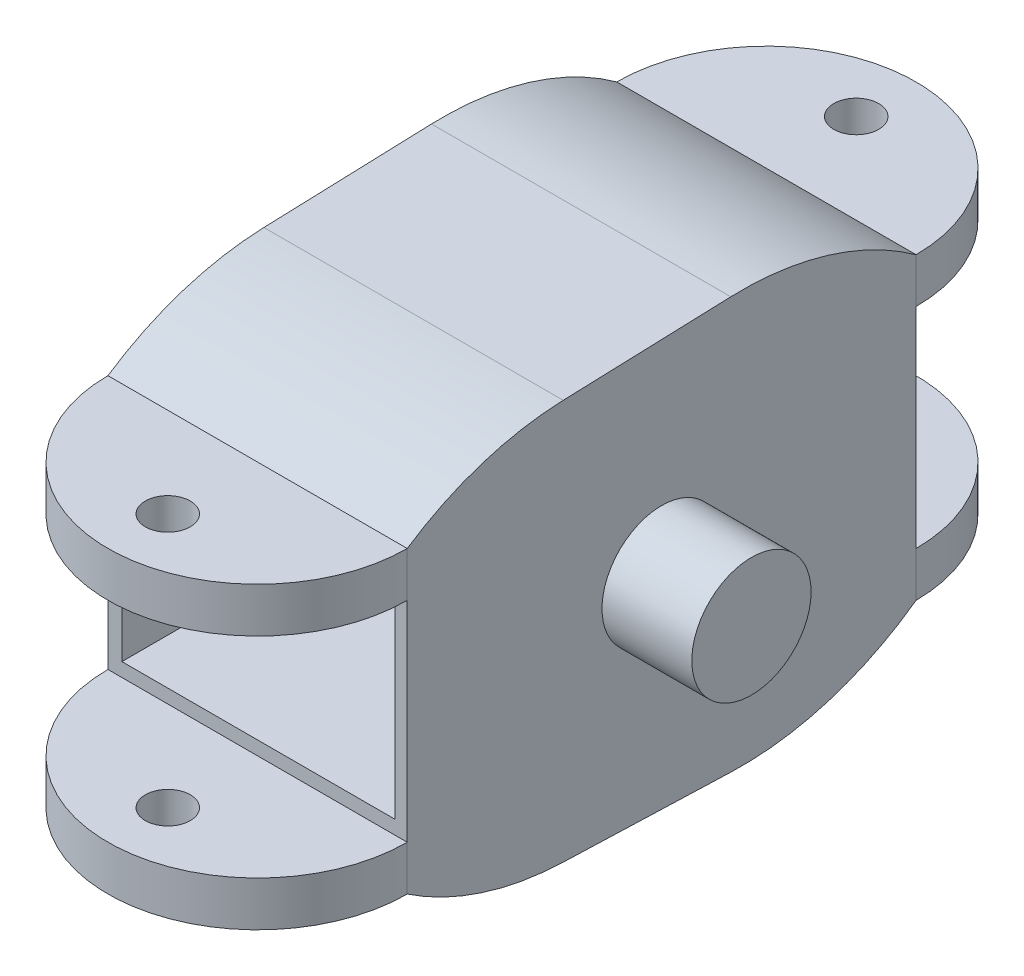
ISO-10303-21;
HEADER;
FILE_DESCRIPTION(('STEP AP214'),'2;1');
FILE_NAME('part.step','',(''),(''),'','','');
FILE_SCHEMA(('AUTOMOTIVE_DESIGN { 1 0 10303 214 1 1 1 1 }'));
ENDSEC;
DATA;
#1=APPLICATION_CONTEXT('core data for automotive mechanical design processes');
#2=APPLICATION_PROTOCOL_DEFINITION('international standard','automotive_design',2000,#1);
#3=PRODUCT_CONTEXT('',#1,'mechanical');
#4=PRODUCT('Part','Part','',(#3));
#5=PRODUCT_RELATED_PRODUCT_CATEGORY('part','',(#4));
#6=PRODUCT_DEFINITION_FORMATION('','',#4);
#7=PRODUCT_DEFINITION_CONTEXT('part definition',#1,'design');
#8=PRODUCT_DEFINITION('design','',#6,#7);
#9=PRODUCT_DEFINITION_SHAPE('','',#8);
#10=(LENGTH_UNIT() NAMED_UNIT(*) SI_UNIT(.MILLI.,.METRE.));
#11=(NAMED_UNIT(*) PLANE_ANGLE_UNIT() SI_UNIT($,.RADIAN.));
#12=(NAMED_UNIT(*) SI_UNIT($,.STERADIAN.) SOLID_ANGLE_UNIT());
#13=UNCERTAINTY_MEASURE_WITH_UNIT(LENGTH_MEASURE(1.E-05),#10,'distance_accuracy_value','');
#14=(GEOMETRIC_REPRESENTATION_CONTEXT(3) GLOBAL_UNCERTAINTY_ASSIGNED_CONTEXT((#13)) GLOBAL_UNIT_ASSIGNED_CONTEXT((#10,
#11,#12)) REPRESENTATION_CONTEXT('',''));
#15=CARTESIAN_POINT('',(0.,0.,0.));
#16=DIRECTION('',(0.,0.,1.));
#17=DIRECTION('',(1.,0.,0.));
#18=AXIS2_PLACEMENT_3D('',#15,#16,#17);
#19=CARTESIAN_POINT('',(0.,-5.,-8.5));
#20=DIRECTION('',(0.,-1.,0.));
#21=DIRECTION('',(0.,0.,-1.));
#22=AXIS2_PLACEMENT_3D('',#19,#20,#21);
#23=PLANE('',#22);
#24=CARTESIAN_POINT('',(5.,-5.,11.5));
#25=DIRECTION('',(0.,-1.,0.));
#26=DIRECTION('',(0.,0.,-1.));
#27=AXIS2_PLACEMENT_3D('',#24,#25,#26);
#28=CIRCLE('',#27,0.75);
#29=CARTESIAN_POINT('',(5.,-5.,10.75));
#30=VERTEX_POINT('',#29);
#31=EDGE_CURVE('E288',#30,#30,#28,.F.);
#32=ORIENTED_EDGE('',*,*,#31,.T.);
#33=EDGE_LOOP('',(#32));
#34=FACE_BOUND('',#33,.T.);
#35=DIRECTION('',(-1.,0.,0.));
#36=VECTOR('',#35,1.);
#37=CARTESIAN_POINT('',(0.,-5.,8.5));
#38=LINE('',#37,#36);
#39=CARTESIAN_POINT('',(0.,-5.,8.5));
#40=VERTEX_POINT('',#39);
#41=CARTESIAN_POINT('',(10.,-5.,8.5));
#42=VERTEX_POINT('',#41);
#43=EDGE_CURVE('E293',#40,#42,#38,.F.);
#44=ORIENTED_EDGE('',*,*,#43,.T.);
#45=CARTESIAN_POINT('',(5.,-5.,8.5));
#46=DIRECTION('',(0.,-1.,0.));
#47=DIRECTION('',(0.,0.,-1.));
#48=AXIS2_PLACEMENT_3D('',#45,#46,#47);
#49=CIRCLE('',#48,5.);
#50=EDGE_CURVE('E289',#40,#42,#49,.F.);
#51=ORIENTED_EDGE('',*,*,#50,.F.);
#52=EDGE_LOOP('',(#44,#51));
#53=FACE_BOUND('',#52,.T.);
#54=ADVANCED_FACE('F35',(#34,#53),#23,.T.);
#55=CARTESIAN_POINT('',(5.,-2.89039903123E-11,-8.5));
#56=DIRECTION('',(0.,1.,0.));
#57=DIRECTION('',(0.,0.,1.));
#58=AXIS2_PLACEMENT_3D('',#55,#56,#57);
#59=CYLINDRICAL_SURFACE('',#58,5.);
#60=CARTESIAN_POINT('',(5.,-5.,-8.5));
#61=DIRECTION('',(0.,1.,0.));
#62=DIRECTION('',(0.,0.,1.));
#63=AXIS2_PLACEMENT_3D('',#60,#61,#62);
#64=CIRCLE('',#63,5.);
#65=CARTESIAN_POINT('',(0.,-5.,-8.5));
#66=VERTEX_POINT('',#65);
#67=CARTESIAN_POINT('',(10.,-5.,-8.5));
#68=VERTEX_POINT('',#67);
#69=EDGE_CURVE('E296',#66,#68,#64,.F.);
#70=ORIENTED_EDGE('',*,*,#69,.F.);
#71=DIRECTION('',(0.,1.,0.));
#72=VECTOR('',#71,1.);
#73=CARTESIAN_POINT('',(0.,-2.89039903123E-11,-8.5));
#74=LINE('',#73,#72);
#75=CARTESIAN_POINT('',(0.,-3.5,-8.5));
#76=VERTEX_POINT('',#75);
#77=EDGE_CURVE('E302',#66,#76,#74,.T.);
#78=ORIENTED_EDGE('',*,*,#77,.T.);
#79=CARTESIAN_POINT('',(5.,-3.5,-8.5));
#80=DIRECTION('',(0.,1.,0.));
#81=DIRECTION('',(0.,0.,1.));
#82=AXIS2_PLACEMENT_3D('',#79,#80,#81);
#83=CIRCLE('',#82,5.);
#84=CARTESIAN_POINT('',(10.,-3.5,-8.5));
#85=VERTEX_POINT('',#84);
#86=EDGE_CURVE('E331',#85,#76,#83,.T.);
#87=ORIENTED_EDGE('',*,*,#86,.F.);
#88=DIRECTION('',(0.,1.,0.));
#89=VECTOR('',#88,1.);
#90=CARTESIAN_POINT('',(10.,1.27577948206E-11,-8.5));
#91=LINE('',#90,#89);
#92=EDGE_CURVE('E182',#85,#68,#91,.F.);
#93=ORIENTED_EDGE('',*,*,#92,.T.);
#94=EDGE_LOOP('',(#70,#78,#87,#93));
#95=FACE_BOUND('',#94,.T.);
#96=ADVANCED_FACE('F453',(#95),#59,.T.);
#97=CARTESIAN_POINT('',(5.,5.,-11.5));
#98=DIRECTION('',(0.,-1.,0.));
#99=DIRECTION('',(0.,0.,-1.));
#100=AXIS2_PLACEMENT_3D('',#97,#98,#99);
#101=CYLINDRICAL_SURFACE('',#100,0.75);
#102=CARTESIAN_POINT('',(5.,-5.,-11.5));
#103=DIRECTION('',(0.,-1.,0.));
#104=DIRECTION('',(0.,0.,-1.));
#105=AXIS2_PLACEMENT_3D('',#102,#103,#104);
#106=CIRCLE('',#105,0.75);
#107=CARTESIAN_POINT('',(5.,-5.,-12.25));
#108=VERTEX_POINT('',#107);
#109=EDGE_CURVE('E328',#108,#108,#106,.F.);
#110=ORIENTED_EDGE('',*,*,#109,.F.);
#111=EDGE_LOOP('',(#110));
#112=FACE_BOUND('',#111,.T.);
#113=CARTESIAN_POINT('',(5.,-3.5,-11.5));
#114=DIRECTION('',(0.,-1.,0.));
#115=DIRECTION('',(0.,0.,-1.));
#116=AXIS2_PLACEMENT_3D('',#113,#114,#115);
#117=CIRCLE('',#116,0.75);
#118=CARTESIAN_POINT('',(5.,-3.5,-12.25));
#119=VERTEX_POINT('',#118);
#120=EDGE_CURVE('E334',#119,#119,#117,.T.);
#121=ORIENTED_EDGE('',*,*,#120,.F.);
#122=EDGE_LOOP('',(#121));
#123=FACE_BOUND('',#122,.T.);
#124=ADVANCED_FACE('F470',(#112,#123),#101,.F.);
#125=CARTESIAN_POINT('',(5.,-2.89039903123E-11,-8.5));
#126=DIRECTION('',(0.,1.,0.));
#127=DIRECTION('',(0.,0.,1.));
#128=AXIS2_PLACEMENT_3D('',#125,#126,#127);
#129=CYLINDRICAL_SURFACE('',#128,5.);
#130=CARTESIAN_POINT('',(5.,3.5,-8.5));
#131=DIRECTION('',(0.,1.,0.));
#132=DIRECTION('',(0.,0.,1.));
#133=AXIS2_PLACEMENT_3D('',#130,#131,#132);
#134=CIRCLE('',#133,5.);
#135=CARTESIAN_POINT('',(10.,3.5,-8.5));
#136=VERTEX_POINT('',#135);
#137=CARTESIAN_POINT('',(0.,3.5,-8.5));
#138=VERTEX_POINT('',#137);
#139=EDGE_CURVE('E337',#136,#138,#134,.T.);
#140=ORIENTED_EDGE('',*,*,#139,.T.);
#141=DIRECTION('',(0.,1.,0.));
#142=VECTOR('',#141,1.);
#143=CARTESIAN_POINT('',(0.,-2.89039903123E-11,-8.5));
#144=LINE('',#143,#142);
#145=CARTESIAN_POINT('',(0.,5.,-8.5));
#146=VERTEX_POINT('',#145);
#147=EDGE_CURVE('E297',#138,#146,#144,.T.);
#148=ORIENTED_EDGE('',*,*,#147,.T.);
#149=CARTESIAN_POINT('',(5.,5.,-8.5));
#150=DIRECTION('',(0.,1.,0.));
#151=DIRECTION('',(0.,0.,1.));
#152=AXIS2_PLACEMENT_3D('',#149,#150,#151);
#153=CIRCLE('',#152,5.);
#154=CARTESIAN_POINT('',(10.,5.,-8.5));
#155=VERTEX_POINT('',#154);
#156=EDGE_CURVE('E343',#146,#155,#153,.F.);
#157=ORIENTED_EDGE('',*,*,#156,.T.);
#158=DIRECTION('',(0.,1.,0.));
#159=VECTOR('',#158,1.);
#160=CARTESIAN_POINT('',(10.,1.27577948206E-11,-8.5));
#161=LINE('',#160,#159);
#162=EDGE_CURVE('E299',#155,#136,#161,.F.);
#163=ORIENTED_EDGE('',*,*,#162,.T.);
#164=EDGE_LOOP('',(#140,#148,#157,#163));
#165=FACE_BOUND('',#164,.T.);
#166=ADVANCED_FACE('F394',(#165),#129,.T.);
#167=CARTESIAN_POINT('',(5.,5.,-11.5));
#168=DIRECTION('',(0.,-1.,0.));
#169=DIRECTION('',(0.,0.,-1.));
#170=AXIS2_PLACEMENT_3D('',#167,#168,#169);
#171=CYLINDRICAL_SURFACE('',#170,0.75);
#172=CARTESIAN_POINT('',(5.,5.,-11.5));
#173=DIRECTION('',(0.,-1.,0.));
#174=DIRECTION('',(0.,0.,-1.));
#175=AXIS2_PLACEMENT_3D('',#172,#173,#174);
#176=CIRCLE('',#175,0.75);
#177=CARTESIAN_POINT('',(5.,5.,-12.25));
#178=VERTEX_POINT('',#177);
#179=EDGE_CURVE('E292',#178,#178,#176,.F.);
#180=ORIENTED_EDGE('',*,*,#179,.T.);
#181=EDGE_LOOP('',(#180));
#182=FACE_BOUND('',#181,.T.);
#183=CARTESIAN_POINT('',(5.,3.5,-11.5));
#184=DIRECTION('',(0.,-1.,0.));
#185=DIRECTION('',(0.,0.,-1.));
#186=AXIS2_PLACEMENT_3D('',#183,#184,#185);
#187=CIRCLE('',#186,0.75);
#188=CARTESIAN_POINT('',(5.,3.5,-12.25));
#189=VERTEX_POINT('',#188);
#190=EDGE_CURVE('E340',#189,#189,#187,.T.);
#191=ORIENTED_EDGE('',*,*,#190,.T.);
#192=EDGE_LOOP('',(#191));
#193=FACE_BOUND('',#192,.T.);
#194=ADVANCED_FACE('F385',(#182,#193),#171,.F.);
#195=CARTESIAN_POINT('',(0.,5.,-8.5));
#196=DIRECTION('',(0.,-1.,0.));
#197=DIRECTION('',(0.,0.,-1.));
#198=AXIS2_PLACEMENT_3D('',#195,#196,#197);
#199=PLANE('',#198);
#200=CARTESIAN_POINT('',(5.,5.,11.5));
#201=DIRECTION('',(0.,-1.,0.));
#202=DIRECTION('',(0.,0.,-1.));
#203=AXIS2_PLACEMENT_3D('',#200,#201,#202);
#204=CIRCLE('',#203,0.75);
#205=CARTESIAN_POINT('',(5.,5.,10.75));
#206=VERTEX_POINT('',#205);
#207=EDGE_CURVE('E283',#206,#206,#204,.T.);
#208=ORIENTED_EDGE('',*,*,#207,.T.);
#209=EDGE_LOOP('',(#208));
#210=FACE_BOUND('',#209,.T.);
#211=CARTESIAN_POINT('',(5.,5.,8.5));
#212=DIRECTION('',(0.,-1.,0.));
#213=DIRECTION('',(0.,0.,-1.));
#214=AXIS2_PLACEMENT_3D('',#211,#212,#213);
#215=CIRCLE('',#214,5.);
#216=CARTESIAN_POINT('',(10.,5.,8.5));
#217=VERTEX_POINT('',#216);
#218=CARTESIAN_POINT('',(0.,5.,8.5));
#219=VERTEX_POINT('',#218);
#220=EDGE_CURVE('E284',#217,#219,#215,.T.);
#221=ORIENTED_EDGE('',*,*,#220,.F.);
#222=DIRECTION('',(-1.,0.,0.));
#223=VECTOR('',#222,1.);
#224=CARTESIAN_POINT('',(0.,5.,8.5));
#225=LINE('',#224,#223);
#226=EDGE_CURVE('E215',#217,#219,#225,.T.);
#227=ORIENTED_EDGE('',*,*,#226,.T.);
#228=EDGE_LOOP('',(#221,#227));
#229=FACE_BOUND('',#228,.T.);
#230=ADVANCED_FACE('F383',(#210,#229),#199,.F.);
#231=CARTESIAN_POINT('',(5.,-2.89039903123E-11,8.5));
#232=DIRECTION('',(0.,-1.,0.));
#233=DIRECTION('',(0.,0.,-1.));
#234=AXIS2_PLACEMENT_3D('',#231,#232,#233);
#235=CYLINDRICAL_SURFACE('',#234,5.);
#236=CARTESIAN_POINT('',(5.,-3.5,8.5));
#237=DIRECTION('',(0.,-1.,0.));
#238=DIRECTION('',(0.,0.,-1.));
#239=AXIS2_PLACEMENT_3D('',#236,#237,#238);
#240=CIRCLE('',#239,5.);
#241=CARTESIAN_POINT('',(0.,-3.5,8.5));
#242=VERTEX_POINT('',#241);
#243=CARTESIAN_POINT('',(10.,-3.5,8.5));
#244=VERTEX_POINT('',#243);
#245=EDGE_CURVE('E211',#242,#244,#240,.F.);
#246=ORIENTED_EDGE('',*,*,#245,.F.);
#247=DIRECTION('',(0.,-1.,0.));
#248=VECTOR('',#247,1.);
#249=CARTESIAN_POINT('',(0.,-2.89039903123E-11,8.5));
#250=LINE('',#249,#248);
#251=EDGE_CURVE('E285',#242,#40,#250,.T.);
#252=ORIENTED_EDGE('',*,*,#251,.T.);
#253=ORIENTED_EDGE('',*,*,#50,.T.);
#254=DIRECTION('',(0.,1.,0.));
#255=VECTOR('',#254,1.);
#256=CARTESIAN_POINT('',(10.,0.,8.5));
#257=LINE('',#256,#255);
#258=EDGE_CURVE('E212',#244,#42,#257,.F.);
#259=ORIENTED_EDGE('',*,*,#258,.F.);
#260=EDGE_LOOP('',(#246,#252,#253,#259));
#261=FACE_BOUND('',#260,.T.);
#262=ADVANCED_FACE('F375',(#261),#235,.T.);
#263=CARTESIAN_POINT('',(5.,5.,11.5));
#264=DIRECTION('',(0.,-1.,0.));
#265=DIRECTION('',(0.,0.,-1.));
#266=AXIS2_PLACEMENT_3D('',#263,#264,#265);
#267=CYLINDRICAL_SURFACE('',#266,0.75);
#268=ORIENTED_EDGE('',*,*,#31,.F.);
#269=EDGE_LOOP('',(#268));
#270=FACE_BOUND('',#269,.T.);
#271=CARTESIAN_POINT('',(5.,-3.5,11.5));
#272=DIRECTION('',(0.,-1.,0.));
#273=DIRECTION('',(0.,0.,-1.));
#274=AXIS2_PLACEMENT_3D('',#271,#272,#273);
#275=CIRCLE('',#274,0.75);
#276=CARTESIAN_POINT('',(5.,-3.5,10.75));
#277=VERTEX_POINT('',#276);
#278=EDGE_CURVE('E349',#277,#277,#275,.T.);
#279=ORIENTED_EDGE('',*,*,#278,.F.);
#280=EDGE_LOOP('',(#279));
#281=FACE_BOUND('',#280,.T.);
#282=ADVANCED_FACE('F392',(#270,#281),#267,.F.);
#283=CARTESIAN_POINT('',(5.,-2.89039903123E-11,8.5));
#284=DIRECTION('',(0.,-1.,0.));
#285=DIRECTION('',(0.,0.,-1.));
#286=AXIS2_PLACEMENT_3D('',#283,#284,#285);
#287=CYLINDRICAL_SURFACE('',#286,5.);
#288=ORIENTED_EDGE('',*,*,#220,.T.);
#289=DIRECTION('',(0.,-1.,0.));
#290=VECTOR('',#289,1.);
#291=CARTESIAN_POINT('',(0.,-2.89039903123E-11,8.5));
#292=LINE('',#291,#290);
#293=CARTESIAN_POINT('',(0.,3.5,8.5));
#294=VERTEX_POINT('',#293);
#295=EDGE_CURVE('E281',#219,#294,#292,.T.);
#296=ORIENTED_EDGE('',*,*,#295,.T.);
#297=CARTESIAN_POINT('',(5.,3.5,8.5));
#298=DIRECTION('',(0.,-1.,0.));
#299=DIRECTION('',(0.,0.,-1.));
#300=AXIS2_PLACEMENT_3D('',#297,#298,#299);
#301=CIRCLE('',#300,5.);
#302=CARTESIAN_POINT('',(10.,3.5,8.5));
#303=VERTEX_POINT('',#302);
#304=EDGE_CURVE('E351',#294,#303,#301,.F.);
#305=ORIENTED_EDGE('',*,*,#304,.T.);
#306=DIRECTION('',(0.,1.,0.));
#307=VECTOR('',#306,1.);
#308=CARTESIAN_POINT('',(10.,0.,8.5));
#309=LINE('',#308,#307);
#310=EDGE_CURVE('E208',#217,#303,#309,.F.);
#311=ORIENTED_EDGE('',*,*,#310,.F.);
#312=EDGE_LOOP('',(#288,#296,#305,#311));
#313=FACE_BOUND('',#312,.T.);
#314=ADVANCED_FACE('F380',(#313),#287,.T.);
#315=CARTESIAN_POINT('',(5.,5.,11.5));
#316=DIRECTION('',(0.,-1.,0.));
#317=DIRECTION('',(0.,0.,-1.));
#318=AXIS2_PLACEMENT_3D('',#315,#316,#317);
#319=CYLINDRICAL_SURFACE('',#318,0.75);
#320=ORIENTED_EDGE('',*,*,#207,.F.);
#321=EDGE_LOOP('',(#320));
#322=FACE_BOUND('',#321,.T.);
#323=CARTESIAN_POINT('',(5.,3.5,11.5));
#324=DIRECTION('',(0.,-1.,0.));
#325=DIRECTION('',(0.,0.,-1.));
#326=AXIS2_PLACEMENT_3D('',#323,#324,#325);
#327=CIRCLE('',#326,0.75);
#328=CARTESIAN_POINT('',(5.,3.5,10.75));
#329=VERTEX_POINT('',#328);
#330=EDGE_CURVE('E193',#329,#329,#327,.T.);
#331=ORIENTED_EDGE('',*,*,#330,.T.);
#332=EDGE_LOOP('',(#331));
#333=FACE_BOUND('',#332,.T.);
#334=ADVANCED_FACE('F358',(#322,#333),#319,.F.);
#335=CARTESIAN_POINT('',(0.,-5.,-8.5));
#336=DIRECTION('',(0.,-1.,0.));
#337=DIRECTION('',(0.,0.,-1.));
#338=AXIS2_PLACEMENT_3D('',#335,#336,#337);
#339=PLANE('',#338);
#340=ORIENTED_EDGE('',*,*,#109,.T.);
#341=EDGE_LOOP('',(#340));
#342=FACE_BOUND('',#341,.T.);
#343=DIRECTION('',(-1.,0.,0.));
#344=VECTOR('',#343,1.);
#345=CARTESIAN_POINT('',(0.,-5.,-8.5));
#346=LINE('',#345,#344);
#347=EDGE_CURVE('E192',#66,#68,#346,.F.);
#348=ORIENTED_EDGE('',*,*,#347,.F.);
#349=ORIENTED_EDGE('',*,*,#69,.T.);
#350=EDGE_LOOP('',(#348,#349));
#351=FACE_BOUND('',#350,.T.);
#352=ADVANCED_FACE('F433',(#342,#351),#339,.T.);
#353=CARTESIAN_POINT('',(0.,-3.5,-13.5));
#354=DIRECTION('',(0.,1.,0.));
#355=DIRECTION('',(0.,0.,1.));
#356=AXIS2_PLACEMENT_3D('',#353,#354,#355);
#357=PLANE('',#356);
#358=ORIENTED_EDGE('',*,*,#120,.T.);
#359=EDGE_LOOP('',(#358));
#360=FACE_BOUND('',#359,.T.);
#361=DIRECTION('',(-1.,0.,0.));
#362=VECTOR('',#361,1.);
#363=CARTESIAN_POINT('',(0.,-3.5,-8.5));
#364=LINE('',#363,#362);
#365=EDGE_CURVE('E275',#85,#76,#364,.T.);
#366=ORIENTED_EDGE('',*,*,#365,.F.);
#367=ORIENTED_EDGE('',*,*,#86,.T.);
#368=EDGE_LOOP('',(#366,#367));
#369=FACE_BOUND('',#368,.T.);
#370=ADVANCED_FACE('F429',(#360,#369),#357,.T.);
#371=CARTESIAN_POINT('',(0.,3.5,-13.5));
#372=DIRECTION('',(0.,1.,0.));
#373=DIRECTION('',(0.,0.,1.));
#374=AXIS2_PLACEMENT_3D('',#371,#372,#373);
#375=PLANE('',#374);
#376=ORIENTED_EDGE('',*,*,#190,.F.);
#377=EDGE_LOOP('',(#376));
#378=FACE_BOUND('',#377,.T.);
#379=ORIENTED_EDGE('',*,*,#139,.F.);
#380=DIRECTION('',(-1.,0.,0.));
#381=VECTOR('',#380,1.);
#382=CARTESIAN_POINT('',(0.,3.5,-8.5));
#383=LINE('',#382,#381);
#384=EDGE_CURVE('E222',#138,#136,#383,.F.);
#385=ORIENTED_EDGE('',*,*,#384,.F.);
#386=EDGE_LOOP('',(#379,#385));
#387=FACE_BOUND('',#386,.T.);
#388=ADVANCED_FACE('F425',(#378,#387),#375,.F.);
#389=CARTESIAN_POINT('',(0.,5.,-8.5));
#390=DIRECTION('',(0.,-1.,0.));
#391=DIRECTION('',(0.,0.,-1.));
#392=AXIS2_PLACEMENT_3D('',#389,#390,#391);
#393=PLANE('',#392);
#394=ORIENTED_EDGE('',*,*,#179,.F.);
#395=EDGE_LOOP('',(#394));
#396=FACE_BOUND('',#395,.T.);
#397=DIRECTION('',(-1.,0.,0.));
#398=VECTOR('',#397,1.);
#399=CARTESIAN_POINT('',(0.,5.,-8.5));
#400=LINE('',#399,#398);
#401=EDGE_CURVE('E216',#155,#146,#400,.T.);
#402=ORIENTED_EDGE('',*,*,#401,.F.);
#403=ORIENTED_EDGE('',*,*,#156,.F.);
#404=EDGE_LOOP('',(#402,#403));
#405=FACE_BOUND('',#404,.T.);
#406=ADVANCED_FACE('F421',(#396,#405),#393,.F.);
#407=CARTESIAN_POINT('',(10.,0.,0.));
#408=DIRECTION('',(1.,0.,0.));
#409=DIRECTION('',(0.,0.,-1.));
#410=AXIS2_PLACEMENT_3D('',#407,#408,#409);
#411=PLANE('',#410);
#412=CARTESIAN_POINT('',(10.,0.,0.));
#413=DIRECTION('',(1.,0.,0.));
#414=DIRECTION('',(0.,0.,-1.));
#415=AXIS2_PLACEMENT_3D('',#412,#413,#414);
#416=CIRCLE('',#415,1.99316548590217);
#417=CARTESIAN_POINT('',(10.,0.,-1.99316548590217));
#418=VERTEX_POINT('',#417);
#419=EDGE_CURVE('E682',#418,#418,#416,.T.);
#420=ORIENTED_EDGE('',*,*,#419,.F.);
#421=EDGE_LOOP('',(#420));
#422=FACE_BOUND('',#421,.T.);
#423=DIRECTION('',(0.,-0.0348994967025033,-0.999390827019096));
#424=VECTOR('',#423,1.);
#425=CARTESIAN_POINT('',(10.,-6.5,8.5));
#426=LINE('',#425,#424);
#427=CARTESIAN_POINT('',(10.,-6.87747506836746,-2.30947166575561));
#428=VERTEX_POINT('',#427);
#429=CARTESIAN_POINT('',(10.,-6.68196607813639,3.28917329758787));
#430=VERTEX_POINT('',#429);
#431=EDGE_CURVE('E189',#428,#430,#426,.F.);
#432=ORIENTED_EDGE('',*,*,#431,.F.);
#433=CARTESIAN_POINT('',(10.,3.1164332018235,-2.65846663278064));
#434=DIRECTION('',(1.,0.,0.));
#435=DIRECTION('',(0.,0.,-1.));
#436=AXIS2_PLACEMENT_3D('',#433,#434,#435);
#437=CIRCLE('',#436,10.);
#438=EDGE_CURVE('E234',#428,#68,#437,.T.);
#439=ORIENTED_EDGE('',*,*,#438,.T.);
#440=ORIENTED_EDGE('',*,*,#92,.F.);
#441=DIRECTION('',(0.,1.,0.));
#442=VECTOR('',#441,1.);
#443=CARTESIAN_POINT('',(10.,-6.5,-8.5));
#444=LINE('',#443,#442);
#445=EDGE_CURVE('E219',#136,#85,#444,.F.);
#446=ORIENTED_EDGE('',*,*,#445,.F.);
#447=ORIENTED_EDGE('',*,*,#162,.F.);
#448=CARTESIAN_POINT('',(10.,-3.1164332018235,-2.65846663278064));
#449=DIRECTION('',(1.,0.,0.));
#450=DIRECTION('',(0.,0.,-1.));
#451=AXIS2_PLACEMENT_3D('',#448,#449,#450);
#452=CIRCLE('',#451,10.);
#453=CARTESIAN_POINT('',(10.,6.87747506836746,-2.30947166575561));
#454=VERTEX_POINT('',#453);
#455=EDGE_CURVE('E57',#155,#454,#452,.T.);
#456=ORIENTED_EDGE('',*,*,#455,.T.);
#457=DIRECTION('',(0.,0.0348994967025033,-0.999390827019096));
#458=VECTOR('',#457,1.);
#459=CARTESIAN_POINT('',(10.,6.5,8.5));
#460=LINE('',#459,#458);
#461=CARTESIAN_POINT('',(10.,6.68196607813639,3.28917329758787));
#462=VERTEX_POINT('',#461);
#463=EDGE_CURVE('E205',#454,#462,#460,.F.);
#464=ORIENTED_EDGE('',*,*,#463,.T.);
#465=CARTESIAN_POINT('',(10.,-3.31194219205457,2.94017833056283));
#466=DIRECTION('',(1.,0.,0.));
#467=DIRECTION('',(0.,0.,-1.));
#468=AXIS2_PLACEMENT_3D('',#465,#466,#467);
#469=CIRCLE('',#468,10.);
#470=EDGE_CURVE('E229',#462,#217,#469,.T.);
#471=ORIENTED_EDGE('',*,*,#470,.T.);
#472=ORIENTED_EDGE('',*,*,#310,.T.);
#473=DIRECTION('',(0.,1.,0.));
#474=VECTOR('',#473,1.);
#475=CARTESIAN_POINT('',(10.,5.,8.5));
#476=LINE('',#475,#474);
#477=EDGE_CURVE('E202',#303,#244,#476,.F.);
#478=ORIENTED_EDGE('',*,*,#477,.T.);
#479=ORIENTED_EDGE('',*,*,#258,.T.);
#480=CARTESIAN_POINT('',(10.,3.31194219205457,2.94017833056283));
#481=DIRECTION('',(1.,0.,0.));
#482=DIRECTION('',(0.,0.,-1.));
#483=AXIS2_PLACEMENT_3D('',#480,#481,#482);
#484=CIRCLE('',#483,10.);
#485=EDGE_CURVE('E231',#42,#430,#484,.T.);
#486=ORIENTED_EDGE('',*,*,#485,.T.);
#487=EDGE_LOOP('',(#432,#439,#440,#446,#447,#456,#464,#471,#472,#478,#479,#486));
#488=FACE_BOUND('',#487,.T.);
#489=ADVANCED_FACE('F267',(#422,#488),#411,.T.);
#490=CARTESIAN_POINT('',(0.,-3.5,-13.5));
#491=DIRECTION('',(0.,1.,0.));
#492=DIRECTION('',(0.,0.,1.));
#493=AXIS2_PLACEMENT_3D('',#490,#491,#492);
#494=PLANE('',#493);
#495=ORIENTED_EDGE('',*,*,#278,.T.);
#496=EDGE_LOOP('',(#495));
#497=FACE_BOUND('',#496,.T.);
#498=DIRECTION('',(-1.,0.,0.));
#499=VECTOR('',#498,1.);
#500=CARTESIAN_POINT('',(0.,-3.5,8.5));
#501=LINE('',#500,#499);
#502=EDGE_CURVE('E201',#244,#242,#501,.T.);
#503=ORIENTED_EDGE('',*,*,#502,.T.);
#504=ORIENTED_EDGE('',*,*,#245,.T.);
#505=EDGE_LOOP('',(#503,#504));
#506=FACE_BOUND('',#505,.T.);
#507=ADVANCED_FACE('F363',(#497,#506),#494,.T.);
#508=CARTESIAN_POINT('',(0.,3.5,-13.5));
#509=DIRECTION('',(0.,1.,0.));
#510=DIRECTION('',(0.,0.,1.));
#511=AXIS2_PLACEMENT_3D('',#508,#509,#510);
#512=PLANE('',#511);
#513=ORIENTED_EDGE('',*,*,#330,.F.);
#514=EDGE_LOOP('',(#513));
#515=FACE_BOUND('',#514,.T.);
#516=DIRECTION('',(-1.,0.,0.));
#517=VECTOR('',#516,1.);
#518=CARTESIAN_POINT('',(0.,3.5,8.5));
#519=LINE('',#518,#517);
#520=EDGE_CURVE('E197',#294,#303,#519,.F.);
#521=ORIENTED_EDGE('',*,*,#520,.T.);
#522=ORIENTED_EDGE('',*,*,#304,.F.);
#523=EDGE_LOOP('',(#521,#522));
#524=FACE_BOUND('',#523,.T.);
#525=ADVANCED_FACE('F360',(#515,#524),#512,.F.);
#526=CARTESIAN_POINT('',(5.00000000186,-6.5,8.5));
#527=DIRECTION('',(0.,-0.999390827019096,0.0348994967025033));
#528=DIRECTION('',(0.,-0.0348994967025033,-0.999390827019096));
#529=AXIS2_PLACEMENT_3D('',#526,#527,#528);
#530=PLANE('',#529);
#531=DIRECTION('',(0.,-0.0348994967042794,-0.999390827019034));
#532=VECTOR('',#531,1.);
#533=CARTESIAN_POINT('',(0.,-6.5,8.5));
#534=LINE('',#533,#532);
#535=CARTESIAN_POINT('',(0.,-6.68196607814503,3.28917329760595));
#536=VERTEX_POINT('',#535);
#537=CARTESIAN_POINT('',(0.,-6.87747506838667,-2.30947166575494));
#538=VERTEX_POINT('',#537);
#539=EDGE_CURVE('E200',#536,#538,#534,.T.);
#540=ORIENTED_EDGE('',*,*,#539,.T.);
#541=DIRECTION('',(1.,0.,0.));
#542=VECTOR('',#541,1.);
#543=CARTESIAN_POINT('',(10.,-6.87747506836746,-2.30947166575561));
#544=LINE('',#543,#542);
#545=EDGE_CURVE('E227',#538,#428,#544,.T.);
#546=ORIENTED_EDGE('',*,*,#545,.T.);
#547=ORIENTED_EDGE('',*,*,#431,.T.);
#548=DIRECTION('',(1.,0.,0.));
#549=VECTOR('',#548,1.);
#550=CARTESIAN_POINT('',(0.,-6.68196607813639,3.28917329758787));
#551=LINE('',#550,#549);
#552=EDGE_CURVE('E253',#430,#536,#551,.F.);
#553=ORIENTED_EDGE('',*,*,#552,.T.);
#554=EDGE_LOOP('',(#540,#546,#547,#553));
#555=FACE_BOUND('',#554,.T.);
#556=ADVANCED_FACE('F264',(#555),#530,.T.);
#557=CARTESIAN_POINT('',(0.,-6.5,-8.5));
#558=DIRECTION('',(0.,0.,-1.));
#559=DIRECTION('',(-1.,0.,0.));
#560=AXIS2_PLACEMENT_3D('',#557,#558,#559);
#561=PLANE('',#560);
#562=DIRECTION('',(0.,-1.,0.));
#563=VECTOR('',#562,1.);
#564=CARTESIAN_POINT('',(9.59744425471598,3.14044580689732,-8.5));
#565=LINE('',#564,#563);
#566=CARTESIAN_POINT('',(9.59744425471598,3.14044580689732,-8.5));
#567=VERTEX_POINT('',#566);
#568=CARTESIAN_POINT('',(9.59744425471598,-3.03931608880958,-8.5));
#569=VERTEX_POINT('',#568);
#570=EDGE_CURVE('E170',#567,#569,#565,.T.);
#571=ORIENTED_EDGE('',*,*,#570,.F.);
#572=DIRECTION('',(1.,0.,0.));
#573=VECTOR('',#572,1.);
#574=CARTESIAN_POINT('',(9.59744425471598,3.14044580689732,-8.5));
#575=LINE('',#574,#573);
#576=CARTESIAN_POINT('',(0.467456646979336,3.14044580689732,-8.5));
#577=VERTEX_POINT('',#576);
#578=EDGE_CURVE('E175',#577,#567,#575,.T.);
#579=ORIENTED_EDGE('',*,*,#578,.F.);
#580=DIRECTION('',(0.,1.,0.));
#581=VECTOR('',#580,1.);
#582=CARTESIAN_POINT('',(0.467456646979336,3.14044580689732,-8.5));
#583=LINE('',#582,#581);
#584=CARTESIAN_POINT('',(0.467456646979336,-3.03931608880958,-8.5));
#585=VERTEX_POINT('',#584);
#586=EDGE_CURVE('E154',#585,#577,#583,.T.);
#587=ORIENTED_EDGE('',*,*,#586,.F.);
#588=DIRECTION('',(-1.,0.,0.));
#589=VECTOR('',#588,1.);
#590=CARTESIAN_POINT('',(9.59744425471598,-3.03931608880958,-8.5));
#591=LINE('',#590,#589);
#592=EDGE_CURVE('E165',#569,#585,#591,.T.);
#593=ORIENTED_EDGE('',*,*,#592,.F.);
#594=EDGE_LOOP('',(#571,#579,#587,#593));
#595=FACE_BOUND('',#594,.T.);
#596=ORIENTED_EDGE('',*,*,#384,.T.);
#597=ORIENTED_EDGE('',*,*,#445,.T.);
#598=ORIENTED_EDGE('',*,*,#365,.T.);
#599=DIRECTION('',(0.,1.,0.));
#600=VECTOR('',#599,1.);
#601=CARTESIAN_POINT('',(0.,0.,-8.5));
#602=LINE('',#601,#600);
#603=EDGE_CURVE('E188',#76,#138,#602,.T.);
#604=ORIENTED_EDGE('',*,*,#603,.T.);
#605=EDGE_LOOP('',(#596,#597,#598,#604));
#606=FACE_BOUND('',#605,.T.);
#607=ADVANCED_FACE('F172',(#595,#606),#561,.T.);
#608=CARTESIAN_POINT('',(5.00000000186,6.5,8.5));
#609=DIRECTION('',(0.,-0.999390827019096,-0.0348994967025033));
#610=DIRECTION('',(0.,0.0348994967025033,-0.999390827019096));
#611=AXIS2_PLACEMENT_3D('',#608,#609,#610);
#612=PLANE('',#611);
#613=ORIENTED_EDGE('',*,*,#463,.F.);
#614=DIRECTION('',(-1.,0.,0.));
#615=VECTOR('',#614,1.);
#616=CARTESIAN_POINT('',(5.00000000186,6.87747506836746,-2.30947166575561));
#617=LINE('',#616,#615);
#618=CARTESIAN_POINT('',(0.,6.87747506834917,-2.30947166577374));
#619=VERTEX_POINT('',#618);
#620=EDGE_CURVE('E43',#454,#619,#617,.T.);
#621=ORIENTED_EDGE('',*,*,#620,.T.);
#622=DIRECTION('',(0.,-0.0348994967007564,0.999390827019157));
#623=VECTOR('',#622,1.);
#624=CARTESIAN_POINT('',(0.,7.09365308133,-8.5));
#625=LINE('',#624,#623);
#626=CARTESIAN_POINT('',(0.,6.68196607812728,3.28917329758755));
#627=VERTEX_POINT('',#626);
#628=EDGE_CURVE('E185',#619,#627,#625,.T.);
#629=ORIENTED_EDGE('',*,*,#628,.T.);
#630=DIRECTION('',(-1.,0.,0.));
#631=VECTOR('',#630,1.);
#632=CARTESIAN_POINT('',(5.00000000186,6.68196607813639,3.28917329758786));
#633=LINE('',#632,#631);
#634=EDGE_CURVE('E50',#627,#462,#633,.F.);
#635=ORIENTED_EDGE('',*,*,#634,.T.);
#636=EDGE_LOOP('',(#613,#621,#629,#635));
#637=FACE_BOUND('',#636,.T.);
#638=ADVANCED_FACE('F238',(#637),#612,.F.);
#639=CARTESIAN_POINT('',(0.,5.,8.5));
#640=DIRECTION('',(0.,0.,-1.));
#641=DIRECTION('',(-1.,0.,0.));
#642=AXIS2_PLACEMENT_3D('',#639,#640,#641);
#643=PLANE('',#642);
#644=DIRECTION('',(1.,0.,0.));
#645=VECTOR('',#644,1.);
#646=CARTESIAN_POINT('',(0.,3.14044580689732,8.5));
#647=LINE('',#646,#645);
#648=CARTESIAN_POINT('',(0.467456646979336,3.14044580689732,8.5));
#649=VERTEX_POINT('',#648);
#650=CARTESIAN_POINT('',(9.59744425471598,3.14044580689732,8.5));
#651=VERTEX_POINT('',#650);
#652=EDGE_CURVE('E314',#649,#651,#647,.T.);
#653=ORIENTED_EDGE('',*,*,#652,.T.);
#654=DIRECTION('',(0.,-1.,0.));
#655=VECTOR('',#654,1.);
#656=CARTESIAN_POINT('',(9.59744425471598,5.,8.5));
#657=LINE('',#656,#655);
#658=CARTESIAN_POINT('',(9.59744425471598,-3.03931608880958,8.5));
#659=VERTEX_POINT('',#658);
#660=EDGE_CURVE('E311',#651,#659,#657,.T.);
#661=ORIENTED_EDGE('',*,*,#660,.T.);
#662=DIRECTION('',(-1.,0.,0.));
#663=VECTOR('',#662,1.);
#664=CARTESIAN_POINT('',(0.,-3.03931608880959,8.5));
#665=LINE('',#664,#663);
#666=CARTESIAN_POINT('',(0.467456646979336,-3.03931608880959,8.5));
#667=VERTEX_POINT('',#666);
#668=EDGE_CURVE('E196',#659,#667,#665,.T.);
#669=ORIENTED_EDGE('',*,*,#668,.T.);
#670=DIRECTION('',(0.,1.,0.));
#671=VECTOR('',#670,1.);
#672=CARTESIAN_POINT('',(0.467456646979336,5.,8.5));
#673=LINE('',#672,#671);
#674=EDGE_CURVE('E157',#667,#649,#673,.T.);
#675=ORIENTED_EDGE('',*,*,#674,.T.);
#676=EDGE_LOOP('',(#653,#661,#669,#675));
#677=FACE_BOUND('',#676,.T.);
#678=DIRECTION('',(0.,1.,0.));
#679=VECTOR('',#678,1.);
#680=CARTESIAN_POINT('',(0.,0.,8.5));
#681=LINE('',#680,#679);
#682=EDGE_CURVE('E187',#294,#242,#681,.F.);
#683=ORIENTED_EDGE('',*,*,#682,.T.);
#684=ORIENTED_EDGE('',*,*,#502,.F.);
#685=ORIENTED_EDGE('',*,*,#477,.F.);
#686=ORIENTED_EDGE('',*,*,#520,.F.);
#687=EDGE_LOOP('',(#683,#684,#685,#686));
#688=FACE_BOUND('',#687,.T.);
#689=ADVANCED_FACE('F369',(#677,#688),#643,.F.);
#690=CARTESIAN_POINT('',(0.,0.,0.));
#691=DIRECTION('',(1.,0.,0.));
#692=DIRECTION('',(0.,0.,-1.));
#693=AXIS2_PLACEMENT_3D('',#690,#691,#692);
#694=PLANE('',#693);
#695=ORIENTED_EDGE('',*,*,#77,.F.);
#696=CARTESIAN_POINT('',(0.,3.1164332018235,-2.65846663278064));
#697=DIRECTION('',(1.,0.,0.));
#698=DIRECTION('',(0.,0.,-1.));
#699=AXIS2_PLACEMENT_3D('',#696,#697,#698);
#700=CIRCLE('',#699,10.);
#701=EDGE_CURVE('E250',#66,#538,#700,.F.);
#702=ORIENTED_EDGE('',*,*,#701,.T.);
#703=ORIENTED_EDGE('',*,*,#539,.F.);
#704=CARTESIAN_POINT('',(0.,3.31194219205457,2.94017833056283));
#705=DIRECTION('',(1.,0.,0.));
#706=DIRECTION('',(0.,0.,-1.));
#707=AXIS2_PLACEMENT_3D('',#704,#705,#706);
#708=CIRCLE('',#707,10.);
#709=EDGE_CURVE('E251',#536,#40,#708,.F.);
#710=ORIENTED_EDGE('',*,*,#709,.T.);
#711=ORIENTED_EDGE('',*,*,#251,.F.);
#712=ORIENTED_EDGE('',*,*,#682,.F.);
#713=ORIENTED_EDGE('',*,*,#295,.F.);
#714=CARTESIAN_POINT('',(0.,-3.31194219205457,2.94017833056283));
#715=DIRECTION('',(1.,0.,0.));
#716=DIRECTION('',(0.,0.,-1.));
#717=AXIS2_PLACEMENT_3D('',#714,#715,#716);
#718=CIRCLE('',#717,10.);
#719=EDGE_CURVE('E247',#219,#627,#718,.F.);
#720=ORIENTED_EDGE('',*,*,#719,.T.);
#721=ORIENTED_EDGE('',*,*,#628,.F.);
#722=CARTESIAN_POINT('',(0.,-3.1164332018235,-2.65846663278064));
#723=DIRECTION('',(1.,0.,0.));
#724=DIRECTION('',(0.,0.,-1.));
#725=AXIS2_PLACEMENT_3D('',#722,#723,#724);
#726=CIRCLE('',#725,10.);
#727=EDGE_CURVE('E244',#619,#146,#726,.F.);
#728=ORIENTED_EDGE('',*,*,#727,.T.);
#729=ORIENTED_EDGE('',*,*,#147,.F.);
#730=ORIENTED_EDGE('',*,*,#603,.F.);
#731=EDGE_LOOP('',(#695,#702,#703,#710,#711,#712,#713,#720,#721,#728,#729,#730));
#732=FACE_BOUND('',#731,.T.);
#733=ADVANCED_FACE('F243',(#732),#694,.F.);
#734=CARTESIAN_POINT('',(9.59744425471598,3.14044580689732,9.50000000000001));
#735=DIRECTION('',(1.,0.,0.));
#736=DIRECTION('',(0.,0.,-1.));
#737=AXIS2_PLACEMENT_3D('',#734,#735,#736);
#738=PLANE('',#737);
#739=DIRECTION('',(0.,0.,-1.));
#740=VECTOR('',#739,1.);
#741=CARTESIAN_POINT('',(9.59744425471598,3.14044580689732,9.50000000000001));
#742=LINE('',#741,#740);
#743=EDGE_CURVE('E180',#651,#567,#742,.T.);
#744=ORIENTED_EDGE('',*,*,#743,.T.);
#745=ORIENTED_EDGE('',*,*,#570,.T.);
#746=DIRECTION('',(0.,0.,-1.));
#747=VECTOR('',#746,1.);
#748=CARTESIAN_POINT('',(9.59744425471598,-3.03931608880958,9.50000000000001));
#749=LINE('',#748,#747);
#750=EDGE_CURVE('E161',#659,#569,#749,.T.);
#751=ORIENTED_EDGE('',*,*,#750,.F.);
#752=ORIENTED_EDGE('',*,*,#660,.F.);
#753=EDGE_LOOP('',(#744,#745,#751,#752));
#754=FACE_BOUND('',#753,.T.);
#755=ADVANCED_FACE('F398',(#754),#738,.F.);
#756=CARTESIAN_POINT('',(9.59744425471598,3.14044580689732,9.50000000000001));
#757=DIRECTION('',(0.,1.,0.));
#758=DIRECTION('',(0.,0.,1.));
#759=AXIS2_PLACEMENT_3D('',#756,#757,#758);
#760=PLANE('',#759);
#761=DIRECTION('',(0.,0.,-1.));
#762=VECTOR('',#761,1.);
#763=CARTESIAN_POINT('',(0.467456646979336,3.14044580689732,9.50000000000001));
#764=LINE('',#763,#762);
#765=EDGE_CURVE('E160',#649,#577,#764,.T.);
#766=ORIENTED_EDGE('',*,*,#765,.T.);
#767=ORIENTED_EDGE('',*,*,#578,.T.);
#768=ORIENTED_EDGE('',*,*,#743,.F.);
#769=ORIENTED_EDGE('',*,*,#652,.F.);
#770=EDGE_LOOP('',(#766,#767,#768,#769));
#771=FACE_BOUND('',#770,.T.);
#772=ADVANCED_FACE('F404',(#771),#760,.F.);
#773=CARTESIAN_POINT('',(0.467456646979336,3.14044580689732,9.50000000000001));
#774=DIRECTION('',(-1.,0.,0.));
#775=DIRECTION('',(0.,0.,1.));
#776=AXIS2_PLACEMENT_3D('',#773,#774,#775);
#777=PLANE('',#776);
#778=CARTESIAN_POINT('',(0.467456646979336,0.,0.));
#779=DIRECTION('',(-1.,0.,0.));
#780=DIRECTION('',(0.,0.,1.));
#781=AXIS2_PLACEMENT_3D('',#778,#779,#780);
#782=CIRCLE('',#781,1.99615958808877);
#783=CARTESIAN_POINT('',(0.467456646979336,0.,1.99615958808877));
#784=VERTEX_POINT('',#783);
#785=EDGE_CURVE('E11',#784,#784,#782,.F.);
#786=ORIENTED_EDGE('',*,*,#785,.F.);
#787=EDGE_LOOP('',(#786));
#788=FACE_BOUND('',#787,.T.);
#789=DIRECTION('',(0.,0.,-1.));
#790=VECTOR('',#789,1.);
#791=CARTESIAN_POINT('',(0.467456646979336,-3.03931608880958,9.50000000000001));
#792=LINE('',#791,#790);
#793=EDGE_CURVE('E149',#667,#585,#792,.T.);
#794=ORIENTED_EDGE('',*,*,#793,.T.);
#795=ORIENTED_EDGE('',*,*,#586,.T.);
#796=ORIENTED_EDGE('',*,*,#765,.F.);
#797=ORIENTED_EDGE('',*,*,#674,.F.);
#798=EDGE_LOOP('',(#794,#795,#796,#797));
#799=FACE_BOUND('',#798,.T.);
#800=ADVANCED_FACE('F151',(#788,#799),#777,.F.);
#801=CARTESIAN_POINT('',(9.59744425471598,-3.03931608880958,9.50000000000001));
#802=DIRECTION('',(0.,-1.,0.));
#803=DIRECTION('',(0.,0.,-1.));
#804=AXIS2_PLACEMENT_3D('',#801,#802,#803);
#805=PLANE('',#804);
#806=ORIENTED_EDGE('',*,*,#750,.T.);
#807=ORIENTED_EDGE('',*,*,#592,.T.);
#808=ORIENTED_EDGE('',*,*,#793,.F.);
#809=ORIENTED_EDGE('',*,*,#668,.F.);
#810=EDGE_LOOP('',(#806,#807,#808,#809));
#811=FACE_BOUND('',#810,.T.);
#812=ADVANCED_FACE('F166',(#811),#805,.F.);
#813=CARTESIAN_POINT('',(0.,3.1164332018235,-2.65846663278064));
#814=DIRECTION('',(-1.,0.,0.));
#815=DIRECTION('',(0.,0.,1.));
#816=AXIS2_PLACEMENT_3D('',#813,#814,#815);
#817=CYLINDRICAL_SURFACE('',#816,10.);
#818=ORIENTED_EDGE('',*,*,#438,.F.);
#819=ORIENTED_EDGE('',*,*,#545,.F.);
#820=ORIENTED_EDGE('',*,*,#701,.F.);
#821=ORIENTED_EDGE('',*,*,#347,.T.);
#822=EDGE_LOOP('',(#818,#819,#820,#821));
#823=FACE_BOUND('',#822,.T.);
#824=ADVANCED_FACE('F272',(#823),#817,.T.);
#825=CARTESIAN_POINT('',(0.,-3.1164332018235,-2.65846663278064));
#826=DIRECTION('',(-1.,0.,0.));
#827=DIRECTION('',(0.,0.,1.));
#828=AXIS2_PLACEMENT_3D('',#825,#826,#827);
#829=CYLINDRICAL_SURFACE('',#828,10.);
#830=ORIENTED_EDGE('',*,*,#727,.F.);
#831=ORIENTED_EDGE('',*,*,#620,.F.);
#832=ORIENTED_EDGE('',*,*,#455,.F.);
#833=ORIENTED_EDGE('',*,*,#401,.T.);
#834=EDGE_LOOP('',(#830,#831,#832,#833));
#835=FACE_BOUND('',#834,.T.);
#836=ADVANCED_FACE('F248',(#835),#829,.T.);
#837=CARTESIAN_POINT('',(0.,3.31194219205457,2.94017833056283));
#838=DIRECTION('',(-1.,0.,0.));
#839=DIRECTION('',(0.,0.,1.));
#840=AXIS2_PLACEMENT_3D('',#837,#838,#839);
#841=CYLINDRICAL_SURFACE('',#840,10.);
#842=ORIENTED_EDGE('',*,*,#485,.F.);
#843=ORIENTED_EDGE('',*,*,#43,.F.);
#844=ORIENTED_EDGE('',*,*,#709,.F.);
#845=ORIENTED_EDGE('',*,*,#552,.F.);
#846=EDGE_LOOP('',(#842,#843,#844,#845));
#847=FACE_BOUND('',#846,.T.);
#848=ADVANCED_FACE('F457',(#847),#841,.T.);
#849=CARTESIAN_POINT('',(0.,-3.31194219205457,2.94017833056283));
#850=DIRECTION('',(-1.,0.,0.));
#851=DIRECTION('',(0.,0.,1.));
#852=AXIS2_PLACEMENT_3D('',#849,#850,#851);
#853=CYLINDRICAL_SURFACE('',#852,10.);
#854=ORIENTED_EDGE('',*,*,#470,.F.);
#855=ORIENTED_EDGE('',*,*,#634,.F.);
#856=ORIENTED_EDGE('',*,*,#719,.F.);
#857=ORIENTED_EDGE('',*,*,#226,.F.);
#858=EDGE_LOOP('',(#854,#855,#856,#857));
#859=FACE_BOUND('',#858,.T.);
#860=ADVANCED_FACE('F37',(#859),#853,.T.);
#861=CARTESIAN_POINT('',(13.,0.,0.));
#862=DIRECTION('',(-1.,0.,0.));
#863=DIRECTION('',(0.,0.,1.));
#864=AXIS2_PLACEMENT_3D('',#861,#862,#863);
#865=CYLINDRICAL_SURFACE('',#864,1.99316548590217);
#866=CARTESIAN_POINT('',(13.,0.,0.));
#867=DIRECTION('',(1.,0.,0.));
#868=DIRECTION('',(0.,0.,-1.));
#869=AXIS2_PLACEMENT_3D('',#866,#867,#868);
#870=CIRCLE('',#869,1.99316548590217);
#871=CARTESIAN_POINT('',(13.,0.,-1.99316548590217));
#872=VERTEX_POINT('',#871);
#873=EDGE_CURVE('E685',#872,#872,#870,.T.);
#874=ORIENTED_EDGE('',*,*,#873,.F.);
#875=EDGE_LOOP('',(#874));
#876=FACE_BOUND('',#875,.T.);
#877=ORIENTED_EDGE('',*,*,#419,.T.);
#878=EDGE_LOOP('',(#877));
#879=FACE_BOUND('',#878,.T.);
#880=ADVANCED_FACE('F463',(#876,#879),#865,.T.);
#881=CARTESIAN_POINT('',(13.,0.,0.));
#882=DIRECTION('',(1.,0.,0.));
#883=DIRECTION('',(0.,0.,-1.));
#884=AXIS2_PLACEMENT_3D('',#881,#882,#883);
#885=PLANE('',#884);
#886=ORIENTED_EDGE('',*,*,#873,.T.);
#887=EDGE_LOOP('',(#886));
#888=FACE_BOUND('',#887,.T.);
#889=ADVANCED_FACE('F647',(#888),#885,.T.);
#890=CARTESIAN_POINT('',(3.46745664697934,0.,0.));
#891=DIRECTION('',(-1.,0.,0.));
#892=DIRECTION('',(0.,0.,1.));
#893=AXIS2_PLACEMENT_3D('',#890,#891,#892);
#894=CYLINDRICAL_SURFACE('',#893,1.99615958808877);
#895=CARTESIAN_POINT('',(3.46745664697934,0.,0.));
#896=DIRECTION('',(1.,0.,0.));
#897=DIRECTION('',(0.,0.,-1.));
#898=AXIS2_PLACEMENT_3D('',#895,#896,#897);
#899=CIRCLE('',#898,1.99615958808877);
#900=CARTESIAN_POINT('',(3.46745664697934,0.,-1.99615958808877));
#901=VERTEX_POINT('',#900);
#902=EDGE_CURVE('E681',#901,#901,#899,.T.);
#903=ORIENTED_EDGE('',*,*,#902,.F.);
#904=EDGE_LOOP('',(#903));
#905=FACE_BOUND('',#904,.T.);
#906=ORIENTED_EDGE('',*,*,#785,.T.);
#907=EDGE_LOOP('',(#906));
#908=FACE_BOUND('',#907,.T.);
#909=ADVANCED_FACE('F655',(#905,#908),#894,.T.);
#910=CARTESIAN_POINT('',(3.46745664697934,0.,0.));
#911=DIRECTION('',(1.,0.,0.));
#912=DIRECTION('',(0.,0.,-1.));
#913=AXIS2_PLACEMENT_3D('',#910,#911,#912);
#914=PLANE('',#913);
#915=ORIENTED_EDGE('',*,*,#902,.T.);
#916=EDGE_LOOP('',(#915));
#917=FACE_BOUND('',#916,.T.);
#918=ADVANCED_FACE('F663',(#917),#914,.T.);
#919=CLOSED_SHELL('',(#54,#96,#124,#166,#194,#230,#262,#282,#314,#334,#352,#370,#388,#406,#489,
#507,#525,#556,#607,#638,#689,#733,#755,#772,#800,#812,#824,#836,#848,#860,#880,#889,#909,#918));
#920=MANIFOLD_SOLID_BREP('B2',#919);
#921=ADVANCED_BREP_SHAPE_REPRESENTATION('',(#18,#920),#14);
#922=SHAPE_DEFINITION_REPRESENTATION(#9,#921);
ENDSEC;
END-ISO-10303-21;
